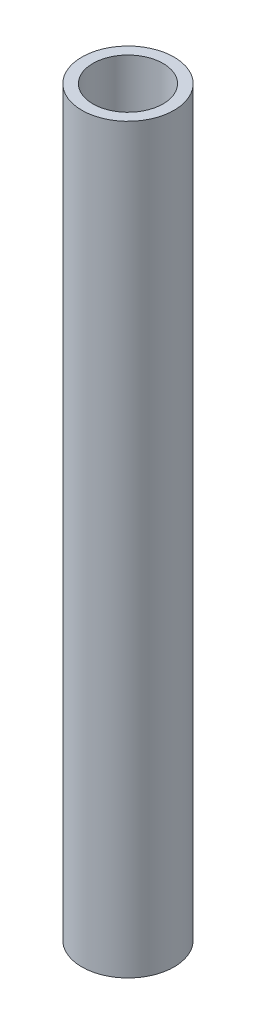
ISO-10303-21;
HEADER;
FILE_DESCRIPTION(('STEP AP214'),'2;1');
FILE_NAME('part.step','',(''),(''),'','','');
FILE_SCHEMA(('AUTOMOTIVE_DESIGN { 1 0 10303 214 1 1 1 1 }'));
ENDSEC;
DATA;
#1=APPLICATION_CONTEXT('core data for automotive mechanical design processes');
#2=APPLICATION_PROTOCOL_DEFINITION('international standard','automotive_design',2000,#1);
#3=PRODUCT_CONTEXT('',#1,'mechanical');
#4=PRODUCT('Part','Part','',(#3));
#5=PRODUCT_RELATED_PRODUCT_CATEGORY('part','',(#4));
#6=PRODUCT_DEFINITION_FORMATION('','',#4);
#7=PRODUCT_DEFINITION_CONTEXT('part definition',#1,'design');
#8=PRODUCT_DEFINITION('design','',#6,#7);
#9=PRODUCT_DEFINITION_SHAPE('','',#8);
#10=(LENGTH_UNIT() NAMED_UNIT(*) SI_UNIT(.MILLI.,.METRE.));
#11=(NAMED_UNIT(*) PLANE_ANGLE_UNIT() SI_UNIT($,.RADIAN.));
#12=(NAMED_UNIT(*) SI_UNIT($,.STERADIAN.) SOLID_ANGLE_UNIT());
#13=UNCERTAINTY_MEASURE_WITH_UNIT(LENGTH_MEASURE(1.E-05),#10,'distance_accuracy_value','');
#14=(GEOMETRIC_REPRESENTATION_CONTEXT(3) GLOBAL_UNCERTAINTY_ASSIGNED_CONTEXT((#13)) GLOBAL_UNIT_ASSIGNED_CONTEXT((#10,
#11,#12)) REPRESENTATION_CONTEXT('',''));
#15=CARTESIAN_POINT('',(0.,0.,0.));
#16=DIRECTION('',(0.,0.,1.));
#17=DIRECTION('',(1.,0.,0.));
#18=AXIS2_PLACEMENT_3D('',#15,#16,#17);
#19=CARTESIAN_POINT('',(0.,18.5,0.));
#20=DIRECTION('',(0.,1.,0.));
#21=DIRECTION('',(0.,0.,1.));
#22=AXIS2_PLACEMENT_3D('',#19,#20,#21);
#23=PLANE('',#22);
#24=CARTESIAN_POINT('',(0.,18.5,0.));
#25=DIRECTION('',(0.,1.,0.));
#26=DIRECTION('',(0.,0.,1.));
#27=AXIS2_PLACEMENT_3D('',#24,#25,#26);
#28=CIRCLE('',#27,2.3);
#29=CARTESIAN_POINT('',(0.,18.5,2.3));
#30=VERTEX_POINT('',#29);
#31=EDGE_CURVE('E10',#30,#30,#28,.T.);
#32=ORIENTED_EDGE('',*,*,#31,.T.);
#33=EDGE_LOOP('',(#32));
#34=FACE_BOUND('',#33,.T.);
#35=CARTESIAN_POINT('',(0.,18.5,0.));
#36=DIRECTION('',(0.,1.,0.));
#37=DIRECTION('',(0.,0.,1.));
#38=AXIS2_PLACEMENT_3D('',#35,#36,#37);
#39=CIRCLE('',#38,1.75);
#40=CARTESIAN_POINT('',(0.,18.5,1.75));
#41=VERTEX_POINT('',#40);
#42=EDGE_CURVE('E52',#41,#41,#39,.T.);
#43=ORIENTED_EDGE('',*,*,#42,.F.);
#44=EDGE_LOOP('',(#43));
#45=FACE_BOUND('',#44,.T.);
#46=ADVANCED_FACE('F41',(#34,#45),#23,.T.);
#47=CARTESIAN_POINT('',(0.,-18.5,0.));
#48=DIRECTION('',(0.,1.,0.));
#49=DIRECTION('',(0.,0.,1.));
#50=AXIS2_PLACEMENT_3D('',#47,#48,#49);
#51=PLANE('',#50);
#52=CARTESIAN_POINT('',(0.,-18.5,0.));
#53=DIRECTION('',(0.,1.,0.));
#54=DIRECTION('',(0.,0.,1.));
#55=AXIS2_PLACEMENT_3D('',#52,#53,#54);
#56=CIRCLE('',#55,2.3);
#57=CARTESIAN_POINT('',(0.,-18.5,2.3));
#58=VERTEX_POINT('',#57);
#59=EDGE_CURVE('E45',#58,#58,#56,.T.);
#60=ORIENTED_EDGE('',*,*,#59,.F.);
#61=EDGE_LOOP('',(#60));
#62=FACE_BOUND('',#61,.T.);
#63=CARTESIAN_POINT('',(0.,-18.5,0.));
#64=DIRECTION('',(0.,1.,0.));
#65=DIRECTION('',(0.,0.,1.));
#66=AXIS2_PLACEMENT_3D('',#63,#64,#65);
#67=CIRCLE('',#66,1.75);
#68=CARTESIAN_POINT('',(0.,-18.5,1.75));
#69=VERTEX_POINT('',#68);
#70=EDGE_CURVE('E54',#69,#69,#67,.T.);
#71=ORIENTED_EDGE('',*,*,#70,.T.);
#72=EDGE_LOOP('',(#71));
#73=FACE_BOUND('',#72,.T.);
#74=ADVANCED_FACE('F64',(#62,#73),#51,.F.);
#75=CARTESIAN_POINT('',(0.,18.5,0.));
#76=DIRECTION('',(0.,-1.,0.));
#77=DIRECTION('',(0.,0.,-1.));
#78=AXIS2_PLACEMENT_3D('',#75,#76,#77);
#79=CYLINDRICAL_SURFACE('',#78,2.3);
#80=ORIENTED_EDGE('',*,*,#31,.F.);
#81=EDGE_LOOP('',(#80));
#82=FACE_BOUND('',#81,.T.);
#83=ORIENTED_EDGE('',*,*,#59,.T.);
#84=EDGE_LOOP('',(#83));
#85=FACE_BOUND('',#84,.T.);
#86=ADVANCED_FACE('F43',(#82,#85),#79,.T.);
#87=CARTESIAN_POINT('',(0.,18.5,0.));
#88=DIRECTION('',(0.,-1.,0.));
#89=DIRECTION('',(0.,0.,-1.));
#90=AXIS2_PLACEMENT_3D('',#87,#88,#89);
#91=CYLINDRICAL_SURFACE('',#90,1.75);
#92=ORIENTED_EDGE('',*,*,#42,.T.);
#93=EDGE_LOOP('',(#92));
#94=FACE_BOUND('',#93,.T.);
#95=ORIENTED_EDGE('',*,*,#70,.F.);
#96=EDGE_LOOP('',(#95));
#97=FACE_BOUND('',#96,.T.);
#98=ADVANCED_FACE('F60',(#94,#97),#91,.F.);
#99=CLOSED_SHELL('',(#46,#74,#86,#98));
#100=MANIFOLD_SOLID_BREP('B2',#99);
#101=ADVANCED_BREP_SHAPE_REPRESENTATION('',(#18,#100),#14);
#102=SHAPE_DEFINITION_REPRESENTATION(#9,#101);
ENDSEC;
END-ISO-10303-21;
